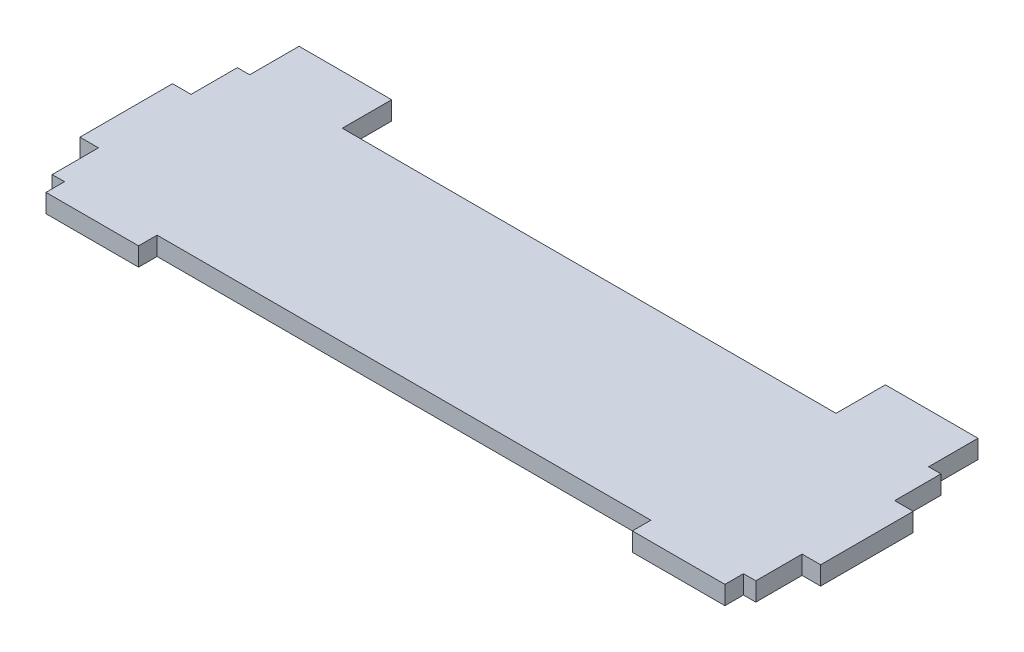
ISO-10303-21;
HEADER;
FILE_DESCRIPTION(('STEP AP214'),'2;1');
FILE_NAME('part.step','',(''),(''),'','','');
FILE_SCHEMA(('AUTOMOTIVE_DESIGN { 1 0 10303 214 1 1 1 1 }'));
ENDSEC;
DATA;
#1=APPLICATION_CONTEXT('core data for automotive mechanical design processes');
#2=APPLICATION_PROTOCOL_DEFINITION('international standard','automotive_design',2000,#1);
#3=PRODUCT_CONTEXT('',#1,'mechanical');
#4=PRODUCT('Part','Part','',(#3));
#5=PRODUCT_RELATED_PRODUCT_CATEGORY('part','',(#4));
#6=PRODUCT_DEFINITION_FORMATION('','',#4);
#7=PRODUCT_DEFINITION_CONTEXT('part definition',#1,'design');
#8=PRODUCT_DEFINITION('design','',#6,#7);
#9=PRODUCT_DEFINITION_SHAPE('','',#8);
#10=(LENGTH_UNIT() NAMED_UNIT(*) SI_UNIT(.MILLI.,.METRE.));
#11=(NAMED_UNIT(*) PLANE_ANGLE_UNIT() SI_UNIT($,.RADIAN.));
#12=(NAMED_UNIT(*) SI_UNIT($,.STERADIAN.) SOLID_ANGLE_UNIT());
#13=UNCERTAINTY_MEASURE_WITH_UNIT(LENGTH_MEASURE(1.E-05),#10,'distance_accuracy_value','');
#14=(GEOMETRIC_REPRESENTATION_CONTEXT(3) GLOBAL_UNCERTAINTY_ASSIGNED_CONTEXT((#13)) GLOBAL_UNIT_ASSIGNED_CONTEXT((#10,
#11,#12)) REPRESENTATION_CONTEXT('',''));
#15=CARTESIAN_POINT('',(0.,0.,0.));
#16=DIRECTION('',(0.,0.,1.));
#17=DIRECTION('',(1.,0.,0.));
#18=AXIS2_PLACEMENT_3D('',#15,#16,#17);
#19=CARTESIAN_POINT('',(57.,3.,-7.49999999999875));
#20=DIRECTION('',(0.,0.,1.));
#21=DIRECTION('',(1.,0.,0.));
#22=AXIS2_PLACEMENT_3D('',#19,#20,#21);
#23=PLANE('',#22);
#24=DIRECTION('',(-1.,0.,0.));
#25=VECTOR('',#24,1.);
#26=CARTESIAN_POINT('',(57.,0.,-7.49999999999875));
#27=LINE('',#26,#25);
#28=CARTESIAN_POINT('',(60.,0.,-7.49999999999875));
#29=VERTEX_POINT('',#28);
#30=CARTESIAN_POINT('',(57.,0.,-7.49999999999875));
#31=VERTEX_POINT('',#30);
#32=EDGE_CURVE('E249',#29,#31,#27,.T.);
#33=ORIENTED_EDGE('',*,*,#32,.T.);
#34=DIRECTION('',(0.,-1.,0.));
#35=VECTOR('',#34,1.);
#36=CARTESIAN_POINT('',(57.,3.,-7.49999999999875));
#37=LINE('',#36,#35);
#38=CARTESIAN_POINT('',(57.,3.,-7.49999999999875));
#39=VERTEX_POINT('',#38);
#40=EDGE_CURVE('E11',#39,#31,#37,.T.);
#41=ORIENTED_EDGE('',*,*,#40,.F.);
#42=DIRECTION('',(-1.,0.,0.));
#43=VECTOR('',#42,1.);
#44=CARTESIAN_POINT('',(57.,3.,-7.49999999999875));
#45=LINE('',#44,#43);
#46=CARTESIAN_POINT('',(60.,3.,-7.49999999999875));
#47=VERTEX_POINT('',#46);
#48=EDGE_CURVE('E303',#47,#39,#45,.T.);
#49=ORIENTED_EDGE('',*,*,#48,.F.);
#50=DIRECTION('',(0.,-1.,0.));
#51=VECTOR('',#50,1.);
#52=CARTESIAN_POINT('',(60.,3.,-7.49999999999875));
#53=LINE('',#52,#51);
#54=EDGE_CURVE('E245',#47,#29,#53,.T.);
#55=ORIENTED_EDGE('',*,*,#54,.T.);
#56=EDGE_LOOP('',(#33,#41,#49,#55));
#57=FACE_BOUND('',#56,.T.);
#58=ADVANCED_FACE('F33',(#57),#23,.F.);
#59=CARTESIAN_POINT('',(57.,3.,-15.));
#60=DIRECTION('',(-1.,0.,0.));
#61=DIRECTION('',(0.,0.,1.));
#62=AXIS2_PLACEMENT_3D('',#59,#60,#61);
#63=PLANE('',#62);
#64=DIRECTION('',(0.,0.,-1.));
#65=VECTOR('',#64,1.);
#66=CARTESIAN_POINT('',(57.,0.,-15.));
#67=LINE('',#66,#65);
#68=CARTESIAN_POINT('',(57.,0.,-15.));
#69=VERTEX_POINT('',#68);
#70=EDGE_CURVE('E252',#31,#69,#67,.T.);
#71=ORIENTED_EDGE('',*,*,#70,.T.);
#72=DIRECTION('',(0.,-1.,0.));
#73=VECTOR('',#72,1.);
#74=CARTESIAN_POINT('',(57.,3.,-15.));
#75=LINE('',#74,#73);
#76=CARTESIAN_POINT('',(57.,3.,-15.));
#77=VERTEX_POINT('',#76);
#78=EDGE_CURVE('E41',#77,#69,#75,.T.);
#79=ORIENTED_EDGE('',*,*,#78,.F.);
#80=DIRECTION('',(0.,0.,-1.));
#81=VECTOR('',#80,1.);
#82=CARTESIAN_POINT('',(57.,3.,-15.));
#83=LINE('',#82,#81);
#84=EDGE_CURVE('E152',#39,#77,#83,.T.);
#85=ORIENTED_EDGE('',*,*,#84,.F.);
#86=ORIENTED_EDGE('',*,*,#40,.T.);
#87=EDGE_LOOP('',(#71,#79,#85,#86));
#88=FACE_BOUND('',#87,.T.);
#89=ADVANCED_FACE('F461',(#88),#63,.F.);
#90=CARTESIAN_POINT('',(55.,3.,-15.));
#91=DIRECTION('',(0.,0.,1.));
#92=DIRECTION('',(1.,0.,0.));
#93=AXIS2_PLACEMENT_3D('',#90,#91,#92);
#94=PLANE('',#93);
#95=DIRECTION('',(-1.,0.,0.));
#96=VECTOR('',#95,1.);
#97=CARTESIAN_POINT('',(55.,0.,-15.));
#98=LINE('',#97,#96);
#99=CARTESIAN_POINT('',(55.,0.,-15.));
#100=VERTEX_POINT('',#99);
#101=EDGE_CURVE('E254',#69,#100,#98,.T.);
#102=ORIENTED_EDGE('',*,*,#101,.T.);
#103=DIRECTION('',(0.,-1.,0.));
#104=VECTOR('',#103,1.);
#105=CARTESIAN_POINT('',(55.,3.,-15.));
#106=LINE('',#105,#104);
#107=CARTESIAN_POINT('',(55.,3.,-15.));
#108=VERTEX_POINT('',#107);
#109=EDGE_CURVE('E370',#108,#100,#106,.T.);
#110=ORIENTED_EDGE('',*,*,#109,.F.);
#111=DIRECTION('',(-1.,0.,0.));
#112=VECTOR('',#111,1.);
#113=CARTESIAN_POINT('',(55.,3.,-15.));
#114=LINE('',#113,#112);
#115=EDGE_CURVE('E378',#77,#108,#114,.T.);
#116=ORIENTED_EDGE('',*,*,#115,.F.);
#117=ORIENTED_EDGE('',*,*,#78,.T.);
#118=EDGE_LOOP('',(#102,#110,#116,#117));
#119=FACE_BOUND('',#118,.T.);
#120=ADVANCED_FACE('F376',(#119),#94,.F.);
#121=CARTESIAN_POINT('',(55.,3.,-23.));
#122=DIRECTION('',(-1.,0.,0.));
#123=DIRECTION('',(0.,0.,1.));
#124=AXIS2_PLACEMENT_3D('',#121,#122,#123);
#125=PLANE('',#124);
#126=DIRECTION('',(0.,0.,-1.));
#127=VECTOR('',#126,1.);
#128=CARTESIAN_POINT('',(55.,0.,-23.));
#129=LINE('',#128,#127);
#130=CARTESIAN_POINT('',(55.,0.,-23.));
#131=VERTEX_POINT('',#130);
#132=EDGE_CURVE('E256',#100,#131,#129,.T.);
#133=ORIENTED_EDGE('',*,*,#132,.T.);
#134=DIRECTION('',(0.,-1.,0.));
#135=VECTOR('',#134,1.);
#136=CARTESIAN_POINT('',(55.,3.,-23.));
#137=LINE('',#136,#135);
#138=CARTESIAN_POINT('',(55.,3.,-23.));
#139=VERTEX_POINT('',#138);
#140=EDGE_CURVE('E367',#139,#131,#137,.T.);
#141=ORIENTED_EDGE('',*,*,#140,.F.);
#142=DIRECTION('',(0.,0.,-1.));
#143=VECTOR('',#142,1.);
#144=CARTESIAN_POINT('',(55.,3.,-23.));
#145=LINE('',#144,#143);
#146=EDGE_CURVE('E396',#108,#139,#145,.T.);
#147=ORIENTED_EDGE('',*,*,#146,.F.);
#148=ORIENTED_EDGE('',*,*,#109,.T.);
#149=EDGE_LOOP('',(#133,#141,#147,#148));
#150=FACE_BOUND('',#149,.T.);
#151=ADVANCED_FACE('F387',(#150),#125,.F.);
#152=CARTESIAN_POINT('',(40.,3.,-23.));
#153=DIRECTION('',(0.,0.,1.));
#154=DIRECTION('',(1.,0.,0.));
#155=AXIS2_PLACEMENT_3D('',#152,#153,#154);
#156=PLANE('',#155);
#157=DIRECTION('',(-1.,0.,0.));
#158=VECTOR('',#157,1.);
#159=CARTESIAN_POINT('',(40.,0.,-23.));
#160=LINE('',#159,#158);
#161=CARTESIAN_POINT('',(40.,0.,-23.));
#162=VERTEX_POINT('',#161);
#163=EDGE_CURVE('E258',#131,#162,#160,.T.);
#164=ORIENTED_EDGE('',*,*,#163,.T.);
#165=DIRECTION('',(0.,-1.,0.));
#166=VECTOR('',#165,1.);
#167=CARTESIAN_POINT('',(40.,3.,-23.));
#168=LINE('',#167,#166);
#169=CARTESIAN_POINT('',(40.,3.,-23.));
#170=VERTEX_POINT('',#169);
#171=EDGE_CURVE('E364',#170,#162,#168,.T.);
#172=ORIENTED_EDGE('',*,*,#171,.F.);
#173=DIRECTION('',(-1.,0.,0.));
#174=VECTOR('',#173,1.);
#175=CARTESIAN_POINT('',(40.,3.,-23.));
#176=LINE('',#175,#174);
#177=EDGE_CURVE('E393',#139,#170,#176,.T.);
#178=ORIENTED_EDGE('',*,*,#177,.F.);
#179=ORIENTED_EDGE('',*,*,#140,.T.);
#180=EDGE_LOOP('',(#164,#172,#178,#179));
#181=FACE_BOUND('',#180,.T.);
#182=ADVANCED_FACE('F391',(#181),#156,.F.);
#183=CARTESIAN_POINT('',(40.,3.,-15.));
#184=DIRECTION('',(1.,0.,0.));
#185=DIRECTION('',(0.,0.,-1.));
#186=AXIS2_PLACEMENT_3D('',#183,#184,#185);
#187=PLANE('',#186);
#188=DIRECTION('',(0.,0.,1.));
#189=VECTOR('',#188,1.);
#190=CARTESIAN_POINT('',(40.,0.,-15.));
#191=LINE('',#190,#189);
#192=CARTESIAN_POINT('',(40.,0.,-15.));
#193=VERTEX_POINT('',#192);
#194=EDGE_CURVE('E260',#162,#193,#191,.T.);
#195=ORIENTED_EDGE('',*,*,#194,.T.);
#196=DIRECTION('',(0.,-1.,0.));
#197=VECTOR('',#196,1.);
#198=CARTESIAN_POINT('',(40.,3.,-15.));
#199=LINE('',#198,#197);
#200=CARTESIAN_POINT('',(40.,3.,-15.));
#201=VERTEX_POINT('',#200);
#202=EDGE_CURVE('E361',#201,#193,#199,.T.);
#203=ORIENTED_EDGE('',*,*,#202,.F.);
#204=DIRECTION('',(0.,0.,1.));
#205=VECTOR('',#204,1.);
#206=CARTESIAN_POINT('',(40.,3.,-15.));
#207=LINE('',#206,#205);
#208=EDGE_CURVE('E395',#170,#201,#207,.T.);
#209=ORIENTED_EDGE('',*,*,#208,.F.);
#210=ORIENTED_EDGE('',*,*,#171,.T.);
#211=EDGE_LOOP('',(#195,#203,#209,#210));
#212=FACE_BOUND('',#211,.T.);
#213=ADVANCED_FACE('F474',(#212),#187,.F.);
#214=CARTESIAN_POINT('',(-40.,3.,-15.));
#215=DIRECTION('',(0.,0.,1.));
#216=DIRECTION('',(1.,0.,0.));
#217=AXIS2_PLACEMENT_3D('',#214,#215,#216);
#218=PLANE('',#217);
#219=DIRECTION('',(-1.,0.,0.));
#220=VECTOR('',#219,1.);
#221=CARTESIAN_POINT('',(-40.,0.,-15.));
#222=LINE('',#221,#220);
#223=CARTESIAN_POINT('',(-40.,0.,-15.));
#224=VERTEX_POINT('',#223);
#225=EDGE_CURVE('E262',#193,#224,#222,.T.);
#226=ORIENTED_EDGE('',*,*,#225,.T.);
#227=DIRECTION('',(0.,-1.,0.));
#228=VECTOR('',#227,1.);
#229=CARTESIAN_POINT('',(-40.,3.,-15.));
#230=LINE('',#229,#228);
#231=CARTESIAN_POINT('',(-40.,3.,-15.));
#232=VERTEX_POINT('',#231);
#233=EDGE_CURVE('E358',#232,#224,#230,.T.);
#234=ORIENTED_EDGE('',*,*,#233,.F.);
#235=DIRECTION('',(-1.,0.,0.));
#236=VECTOR('',#235,1.);
#237=CARTESIAN_POINT('',(-40.,3.,-15.));
#238=LINE('',#237,#236);
#239=EDGE_CURVE('E398',#201,#232,#238,.T.);
#240=ORIENTED_EDGE('',*,*,#239,.F.);
#241=ORIENTED_EDGE('',*,*,#202,.T.);
#242=EDGE_LOOP('',(#226,#234,#240,#241));
#243=FACE_BOUND('',#242,.T.);
#244=ADVANCED_FACE('F477',(#243),#218,.F.);
#245=CARTESIAN_POINT('',(-40.,3.,-23.));
#246=DIRECTION('',(-1.,0.,0.));
#247=DIRECTION('',(0.,0.,1.));
#248=AXIS2_PLACEMENT_3D('',#245,#246,#247);
#249=PLANE('',#248);
#250=DIRECTION('',(0.,0.,-1.));
#251=VECTOR('',#250,1.);
#252=CARTESIAN_POINT('',(-40.,0.,-23.));
#253=LINE('',#252,#251);
#254=CARTESIAN_POINT('',(-40.,0.,-23.));
#255=VERTEX_POINT('',#254);
#256=EDGE_CURVE('E264',#224,#255,#253,.T.);
#257=ORIENTED_EDGE('',*,*,#256,.T.);
#258=DIRECTION('',(0.,-1.,0.));
#259=VECTOR('',#258,1.);
#260=CARTESIAN_POINT('',(-40.,3.,-23.));
#261=LINE('',#260,#259);
#262=CARTESIAN_POINT('',(-40.,3.,-23.));
#263=VERTEX_POINT('',#262);
#264=EDGE_CURVE('E355',#263,#255,#261,.T.);
#265=ORIENTED_EDGE('',*,*,#264,.F.);
#266=DIRECTION('',(0.,0.,-1.));
#267=VECTOR('',#266,1.);
#268=CARTESIAN_POINT('',(-40.,3.,-23.));
#269=LINE('',#268,#267);
#270=EDGE_CURVE('E404',#232,#263,#269,.T.);
#271=ORIENTED_EDGE('',*,*,#270,.F.);
#272=ORIENTED_EDGE('',*,*,#233,.T.);
#273=EDGE_LOOP('',(#257,#265,#271,#272));
#274=FACE_BOUND('',#273,.T.);
#275=ADVANCED_FACE('F481',(#274),#249,.F.);
#276=CARTESIAN_POINT('',(-55.,3.,-23.));
#277=DIRECTION('',(0.,0.,1.));
#278=DIRECTION('',(1.,0.,0.));
#279=AXIS2_PLACEMENT_3D('',#276,#277,#278);
#280=PLANE('',#279);
#281=DIRECTION('',(-1.,0.,0.));
#282=VECTOR('',#281,1.);
#283=CARTESIAN_POINT('',(-55.,0.,-23.));
#284=LINE('',#283,#282);
#285=CARTESIAN_POINT('',(-55.,0.,-23.));
#286=VERTEX_POINT('',#285);
#287=EDGE_CURVE('E266',#255,#286,#284,.T.);
#288=ORIENTED_EDGE('',*,*,#287,.T.);
#289=DIRECTION('',(0.,-1.,0.));
#290=VECTOR('',#289,1.);
#291=CARTESIAN_POINT('',(-55.,3.,-23.));
#292=LINE('',#291,#290);
#293=CARTESIAN_POINT('',(-55.,3.,-23.));
#294=VERTEX_POINT('',#293);
#295=EDGE_CURVE('E352',#294,#286,#292,.T.);
#296=ORIENTED_EDGE('',*,*,#295,.F.);
#297=DIRECTION('',(-1.,0.,0.));
#298=VECTOR('',#297,1.);
#299=CARTESIAN_POINT('',(-55.,3.,-23.));
#300=LINE('',#299,#298);
#301=EDGE_CURVE('E406',#263,#294,#300,.T.);
#302=ORIENTED_EDGE('',*,*,#301,.F.);
#303=ORIENTED_EDGE('',*,*,#264,.T.);
#304=EDGE_LOOP('',(#288,#296,#302,#303));
#305=FACE_BOUND('',#304,.T.);
#306=ADVANCED_FACE('F485',(#305),#280,.F.);
#307=CARTESIAN_POINT('',(-55.,3.,-15.));
#308=DIRECTION('',(1.,0.,0.));
#309=DIRECTION('',(0.,0.,-1.));
#310=AXIS2_PLACEMENT_3D('',#307,#308,#309);
#311=PLANE('',#310);
#312=DIRECTION('',(0.,0.,1.));
#313=VECTOR('',#312,1.);
#314=CARTESIAN_POINT('',(-55.,0.,-15.));
#315=LINE('',#314,#313);
#316=CARTESIAN_POINT('',(-55.,0.,-15.));
#317=VERTEX_POINT('',#316);
#318=EDGE_CURVE('E268',#286,#317,#315,.T.);
#319=ORIENTED_EDGE('',*,*,#318,.T.);
#320=DIRECTION('',(0.,-1.,0.));
#321=VECTOR('',#320,1.);
#322=CARTESIAN_POINT('',(-55.,3.,-15.));
#323=LINE('',#322,#321);
#324=CARTESIAN_POINT('',(-55.,3.,-15.));
#325=VERTEX_POINT('',#324);
#326=EDGE_CURVE('E349',#325,#317,#323,.T.);
#327=ORIENTED_EDGE('',*,*,#326,.F.);
#328=DIRECTION('',(0.,0.,1.));
#329=VECTOR('',#328,1.);
#330=CARTESIAN_POINT('',(-55.,3.,-15.));
#331=LINE('',#330,#329);
#332=EDGE_CURVE('E408',#294,#325,#331,.T.);
#333=ORIENTED_EDGE('',*,*,#332,.F.);
#334=ORIENTED_EDGE('',*,*,#295,.T.);
#335=EDGE_LOOP('',(#319,#327,#333,#334));
#336=FACE_BOUND('',#335,.T.);
#337=ADVANCED_FACE('F489',(#336),#311,.F.);
#338=CARTESIAN_POINT('',(-57.,3.,-15.));
#339=DIRECTION('',(0.,0.,1.));
#340=DIRECTION('',(1.,0.,0.));
#341=AXIS2_PLACEMENT_3D('',#338,#339,#340);
#342=PLANE('',#341);
#343=DIRECTION('',(-1.,0.,0.));
#344=VECTOR('',#343,1.);
#345=CARTESIAN_POINT('',(-57.,0.,-15.));
#346=LINE('',#345,#344);
#347=CARTESIAN_POINT('',(-57.,0.,-15.));
#348=VERTEX_POINT('',#347);
#349=EDGE_CURVE('E270',#317,#348,#346,.T.);
#350=ORIENTED_EDGE('',*,*,#349,.T.);
#351=DIRECTION('',(0.,-1.,0.));
#352=VECTOR('',#351,1.);
#353=CARTESIAN_POINT('',(-57.,3.,-15.));
#354=LINE('',#353,#352);
#355=CARTESIAN_POINT('',(-57.,3.,-15.));
#356=VERTEX_POINT('',#355);
#357=EDGE_CURVE('E346',#356,#348,#354,.T.);
#358=ORIENTED_EDGE('',*,*,#357,.F.);
#359=DIRECTION('',(-1.,0.,0.));
#360=VECTOR('',#359,1.);
#361=CARTESIAN_POINT('',(-57.,3.,-15.));
#362=LINE('',#361,#360);
#363=EDGE_CURVE('E410',#325,#356,#362,.T.);
#364=ORIENTED_EDGE('',*,*,#363,.F.);
#365=ORIENTED_EDGE('',*,*,#326,.T.);
#366=EDGE_LOOP('',(#350,#358,#364,#365));
#367=FACE_BOUND('',#366,.T.);
#368=ADVANCED_FACE('F493',(#367),#342,.F.);
#369=CARTESIAN_POINT('',(-57.,3.,-7.5));
#370=DIRECTION('',(1.,0.,0.));
#371=DIRECTION('',(0.,0.,-1.));
#372=AXIS2_PLACEMENT_3D('',#369,#370,#371);
#373=PLANE('',#372);
#374=DIRECTION('',(0.,0.,1.));
#375=VECTOR('',#374,1.);
#376=CARTESIAN_POINT('',(-57.,0.,-7.5));
#377=LINE('',#376,#375);
#378=CARTESIAN_POINT('',(-57.,0.,-7.5));
#379=VERTEX_POINT('',#378);
#380=EDGE_CURVE('E272',#348,#379,#377,.T.);
#381=ORIENTED_EDGE('',*,*,#380,.T.);
#382=DIRECTION('',(0.,-1.,0.));
#383=VECTOR('',#382,1.);
#384=CARTESIAN_POINT('',(-57.,3.,-7.5));
#385=LINE('',#384,#383);
#386=CARTESIAN_POINT('',(-57.,3.,-7.5));
#387=VERTEX_POINT('',#386);
#388=EDGE_CURVE('E343',#387,#379,#385,.T.);
#389=ORIENTED_EDGE('',*,*,#388,.F.);
#390=DIRECTION('',(0.,0.,1.));
#391=VECTOR('',#390,1.);
#392=CARTESIAN_POINT('',(-57.,3.,-7.5));
#393=LINE('',#392,#391);
#394=EDGE_CURVE('E412',#356,#387,#393,.T.);
#395=ORIENTED_EDGE('',*,*,#394,.F.);
#396=ORIENTED_EDGE('',*,*,#357,.T.);
#397=EDGE_LOOP('',(#381,#389,#395,#396));
#398=FACE_BOUND('',#397,.T.);
#399=ADVANCED_FACE('F497',(#398),#373,.F.);
#400=CARTESIAN_POINT('',(-60.,3.,-7.5));
#401=DIRECTION('',(0.,0.,1.));
#402=DIRECTION('',(1.,0.,0.));
#403=AXIS2_PLACEMENT_3D('',#400,#401,#402);
#404=PLANE('',#403);
#405=DIRECTION('',(-1.,0.,0.));
#406=VECTOR('',#405,1.);
#407=CARTESIAN_POINT('',(-60.,0.,-7.5));
#408=LINE('',#407,#406);
#409=CARTESIAN_POINT('',(-60.,0.,-7.5));
#410=VERTEX_POINT('',#409);
#411=EDGE_CURVE('E274',#379,#410,#408,.T.);
#412=ORIENTED_EDGE('',*,*,#411,.T.);
#413=DIRECTION('',(0.,-1.,0.));
#414=VECTOR('',#413,1.);
#415=CARTESIAN_POINT('',(-60.,3.,-7.5));
#416=LINE('',#415,#414);
#417=CARTESIAN_POINT('',(-60.,3.,-7.5));
#418=VERTEX_POINT('',#417);
#419=EDGE_CURVE('E340',#418,#410,#416,.T.);
#420=ORIENTED_EDGE('',*,*,#419,.F.);
#421=DIRECTION('',(-1.,0.,0.));
#422=VECTOR('',#421,1.);
#423=CARTESIAN_POINT('',(-60.,3.,-7.5));
#424=LINE('',#423,#422);
#425=EDGE_CURVE('E414',#387,#418,#424,.T.);
#426=ORIENTED_EDGE('',*,*,#425,.F.);
#427=ORIENTED_EDGE('',*,*,#388,.T.);
#428=EDGE_LOOP('',(#412,#420,#426,#427));
#429=FACE_BOUND('',#428,.T.);
#430=ADVANCED_FACE('F501',(#429),#404,.F.);
#431=CARTESIAN_POINT('',(-60.,3.,7.5));
#432=DIRECTION('',(1.,0.,0.));
#433=DIRECTION('',(0.,0.,-1.));
#434=AXIS2_PLACEMENT_3D('',#431,#432,#433);
#435=PLANE('',#434);
#436=DIRECTION('',(0.,0.,1.));
#437=VECTOR('',#436,1.);
#438=CARTESIAN_POINT('',(-60.,0.,7.5));
#439=LINE('',#438,#437);
#440=CARTESIAN_POINT('',(-60.,0.,7.5));
#441=VERTEX_POINT('',#440);
#442=EDGE_CURVE('E276',#410,#441,#439,.T.);
#443=ORIENTED_EDGE('',*,*,#442,.T.);
#444=DIRECTION('',(0.,-1.,0.));
#445=VECTOR('',#444,1.);
#446=CARTESIAN_POINT('',(-60.,3.,7.5));
#447=LINE('',#446,#445);
#448=CARTESIAN_POINT('',(-60.,3.,7.5));
#449=VERTEX_POINT('',#448);
#450=EDGE_CURVE('E337',#449,#441,#447,.T.);
#451=ORIENTED_EDGE('',*,*,#450,.F.);
#452=DIRECTION('',(0.,0.,1.));
#453=VECTOR('',#452,1.);
#454=CARTESIAN_POINT('',(-60.,3.,7.5));
#455=LINE('',#454,#453);
#456=EDGE_CURVE('E416',#418,#449,#455,.T.);
#457=ORIENTED_EDGE('',*,*,#456,.F.);
#458=ORIENTED_EDGE('',*,*,#419,.T.);
#459=EDGE_LOOP('',(#443,#451,#457,#458));
#460=FACE_BOUND('',#459,.T.);
#461=ADVANCED_FACE('F505',(#460),#435,.F.);
#462=CARTESIAN_POINT('',(-57.,3.,7.5));
#463=DIRECTION('',(0.,0.,-1.));
#464=DIRECTION('',(-1.,0.,0.));
#465=AXIS2_PLACEMENT_3D('',#462,#463,#464);
#466=PLANE('',#465);
#467=DIRECTION('',(1.,0.,0.));
#468=VECTOR('',#467,1.);
#469=CARTESIAN_POINT('',(-57.,0.,7.5));
#470=LINE('',#469,#468);
#471=CARTESIAN_POINT('',(-57.,0.,7.5));
#472=VERTEX_POINT('',#471);
#473=EDGE_CURVE('E278',#441,#472,#470,.T.);
#474=ORIENTED_EDGE('',*,*,#473,.T.);
#475=DIRECTION('',(0.,-1.,0.));
#476=VECTOR('',#475,1.);
#477=CARTESIAN_POINT('',(-57.,3.,7.5));
#478=LINE('',#477,#476);
#479=CARTESIAN_POINT('',(-57.,3.,7.5));
#480=VERTEX_POINT('',#479);
#481=EDGE_CURVE('E334',#480,#472,#478,.T.);
#482=ORIENTED_EDGE('',*,*,#481,.F.);
#483=DIRECTION('',(1.,0.,0.));
#484=VECTOR('',#483,1.);
#485=CARTESIAN_POINT('',(-57.,3.,7.5));
#486=LINE('',#485,#484);
#487=EDGE_CURVE('E418',#449,#480,#486,.T.);
#488=ORIENTED_EDGE('',*,*,#487,.F.);
#489=ORIENTED_EDGE('',*,*,#450,.T.);
#490=EDGE_LOOP('',(#474,#482,#488,#489));
#491=FACE_BOUND('',#490,.T.);
#492=ADVANCED_FACE('F509',(#491),#466,.F.);
#493=CARTESIAN_POINT('',(-57.,3.,15.));
#494=DIRECTION('',(1.,0.,0.));
#495=DIRECTION('',(0.,0.,-1.));
#496=AXIS2_PLACEMENT_3D('',#493,#494,#495);
#497=PLANE('',#496);
#498=DIRECTION('',(0.,0.,1.));
#499=VECTOR('',#498,1.);
#500=CARTESIAN_POINT('',(-57.,0.,15.));
#501=LINE('',#500,#499);
#502=CARTESIAN_POINT('',(-57.,0.,15.));
#503=VERTEX_POINT('',#502);
#504=EDGE_CURVE('E280',#472,#503,#501,.T.);
#505=ORIENTED_EDGE('',*,*,#504,.T.);
#506=DIRECTION('',(0.,-1.,0.));
#507=VECTOR('',#506,1.);
#508=CARTESIAN_POINT('',(-57.,3.,15.));
#509=LINE('',#508,#507);
#510=CARTESIAN_POINT('',(-57.,3.,15.));
#511=VERTEX_POINT('',#510);
#512=EDGE_CURVE('E331',#511,#503,#509,.T.);
#513=ORIENTED_EDGE('',*,*,#512,.F.);
#514=DIRECTION('',(0.,0.,1.));
#515=VECTOR('',#514,1.);
#516=CARTESIAN_POINT('',(-57.,3.,15.));
#517=LINE('',#516,#515);
#518=EDGE_CURVE('E420',#480,#511,#517,.T.);
#519=ORIENTED_EDGE('',*,*,#518,.F.);
#520=ORIENTED_EDGE('',*,*,#481,.T.);
#521=EDGE_LOOP('',(#505,#513,#519,#520));
#522=FACE_BOUND('',#521,.T.);
#523=ADVANCED_FACE('F513',(#522),#497,.F.);
#524=CARTESIAN_POINT('',(-57.,3.,15.));
#525=DIRECTION('',(0.,0.,-1.));
#526=DIRECTION('',(-1.,0.,0.));
#527=AXIS2_PLACEMENT_3D('',#524,#525,#526);
#528=PLANE('',#527);
#529=DIRECTION('',(1.,0.,0.));
#530=VECTOR('',#529,1.);
#531=CARTESIAN_POINT('',(-57.,0.,15.));
#532=LINE('',#531,#530);
#533=CARTESIAN_POINT('',(-55.,0.,15.));
#534=VERTEX_POINT('',#533);
#535=EDGE_CURVE('E282',#503,#534,#532,.T.);
#536=ORIENTED_EDGE('',*,*,#535,.T.);
#537=DIRECTION('',(0.,-1.,0.));
#538=VECTOR('',#537,1.);
#539=CARTESIAN_POINT('',(-55.,3.,15.));
#540=LINE('',#539,#538);
#541=CARTESIAN_POINT('',(-55.,3.,15.));
#542=VERTEX_POINT('',#541);
#543=EDGE_CURVE('E328',#542,#534,#540,.T.);
#544=ORIENTED_EDGE('',*,*,#543,.F.);
#545=DIRECTION('',(1.,0.,0.));
#546=VECTOR('',#545,1.);
#547=CARTESIAN_POINT('',(-57.,3.,15.));
#548=LINE('',#547,#546);
#549=EDGE_CURVE('E422',#511,#542,#548,.T.);
#550=ORIENTED_EDGE('',*,*,#549,.F.);
#551=ORIENTED_EDGE('',*,*,#512,.T.);
#552=EDGE_LOOP('',(#536,#544,#550,#551));
#553=FACE_BOUND('',#552,.T.);
#554=ADVANCED_FACE('F517',(#553),#528,.F.);
#555=CARTESIAN_POINT('',(-55.,3.,15.));
#556=DIRECTION('',(1.,0.,0.));
#557=DIRECTION('',(0.,0.,-1.));
#558=AXIS2_PLACEMENT_3D('',#555,#556,#557);
#559=PLANE('',#558);
#560=DIRECTION('',(0.,0.,1.));
#561=VECTOR('',#560,1.);
#562=CARTESIAN_POINT('',(-55.,0.,15.));
#563=LINE('',#562,#561);
#564=CARTESIAN_POINT('',(-55.,0.,18.));
#565=VERTEX_POINT('',#564);
#566=EDGE_CURVE('E284',#534,#565,#563,.T.);
#567=ORIENTED_EDGE('',*,*,#566,.T.);
#568=DIRECTION('',(0.,-1.,0.));
#569=VECTOR('',#568,1.);
#570=CARTESIAN_POINT('',(-55.,3.,18.));
#571=LINE('',#570,#569);
#572=CARTESIAN_POINT('',(-55.,3.,18.));
#573=VERTEX_POINT('',#572);
#574=EDGE_CURVE('E325',#573,#565,#571,.T.);
#575=ORIENTED_EDGE('',*,*,#574,.F.);
#576=DIRECTION('',(0.,0.,1.));
#577=VECTOR('',#576,1.);
#578=CARTESIAN_POINT('',(-55.,3.,15.));
#579=LINE('',#578,#577);
#580=EDGE_CURVE('E424',#542,#573,#579,.T.);
#581=ORIENTED_EDGE('',*,*,#580,.F.);
#582=ORIENTED_EDGE('',*,*,#543,.T.);
#583=EDGE_LOOP('',(#567,#575,#581,#582));
#584=FACE_BOUND('',#583,.T.);
#585=ADVANCED_FACE('F521',(#584),#559,.F.);
#586=CARTESIAN_POINT('',(-55.,3.,18.));
#587=DIRECTION('',(0.,0.,-1.));
#588=DIRECTION('',(-1.,0.,0.));
#589=AXIS2_PLACEMENT_3D('',#586,#587,#588);
#590=PLANE('',#589);
#591=DIRECTION('',(1.,0.,0.));
#592=VECTOR('',#591,1.);
#593=CARTESIAN_POINT('',(-55.,0.,18.));
#594=LINE('',#593,#592);
#595=CARTESIAN_POINT('',(-40.,0.,18.));
#596=VERTEX_POINT('',#595);
#597=EDGE_CURVE('E286',#565,#596,#594,.T.);
#598=ORIENTED_EDGE('',*,*,#597,.T.);
#599=DIRECTION('',(0.,-1.,0.));
#600=VECTOR('',#599,1.);
#601=CARTESIAN_POINT('',(-40.,3.,18.));
#602=LINE('',#601,#600);
#603=CARTESIAN_POINT('',(-40.,3.,18.));
#604=VERTEX_POINT('',#603);
#605=EDGE_CURVE('E322',#604,#596,#602,.T.);
#606=ORIENTED_EDGE('',*,*,#605,.F.);
#607=DIRECTION('',(1.,0.,0.));
#608=VECTOR('',#607,1.);
#609=CARTESIAN_POINT('',(-55.,3.,18.));
#610=LINE('',#609,#608);
#611=EDGE_CURVE('E426',#573,#604,#610,.T.);
#612=ORIENTED_EDGE('',*,*,#611,.F.);
#613=ORIENTED_EDGE('',*,*,#574,.T.);
#614=EDGE_LOOP('',(#598,#606,#612,#613));
#615=FACE_BOUND('',#614,.T.);
#616=ADVANCED_FACE('F525',(#615),#590,.F.);
#617=CARTESIAN_POINT('',(-40.,3.,18.));
#618=DIRECTION('',(-1.,0.,0.));
#619=DIRECTION('',(0.,0.,1.));
#620=AXIS2_PLACEMENT_3D('',#617,#618,#619);
#621=PLANE('',#620);
#622=DIRECTION('',(0.,0.,-1.));
#623=VECTOR('',#622,1.);
#624=CARTESIAN_POINT('',(-40.,0.,18.));
#625=LINE('',#624,#623);
#626=CARTESIAN_POINT('',(-40.,0.,15.));
#627=VERTEX_POINT('',#626);
#628=EDGE_CURVE('E288',#596,#627,#625,.T.);
#629=ORIENTED_EDGE('',*,*,#628,.T.);
#630=DIRECTION('',(0.,-1.,0.));
#631=VECTOR('',#630,1.);
#632=CARTESIAN_POINT('',(-40.,3.,15.));
#633=LINE('',#632,#631);
#634=CARTESIAN_POINT('',(-40.,3.,15.));
#635=VERTEX_POINT('',#634);
#636=EDGE_CURVE('E319',#635,#627,#633,.T.);
#637=ORIENTED_EDGE('',*,*,#636,.F.);
#638=DIRECTION('',(0.,0.,-1.));
#639=VECTOR('',#638,1.);
#640=CARTESIAN_POINT('',(-40.,3.,18.));
#641=LINE('',#640,#639);
#642=EDGE_CURVE('E428',#604,#635,#641,.T.);
#643=ORIENTED_EDGE('',*,*,#642,.F.);
#644=ORIENTED_EDGE('',*,*,#605,.T.);
#645=EDGE_LOOP('',(#629,#637,#643,#644));
#646=FACE_BOUND('',#645,.T.);
#647=ADVANCED_FACE('F529',(#646),#621,.F.);
#648=CARTESIAN_POINT('',(-40.,3.,15.));
#649=DIRECTION('',(0.,0.,-1.));
#650=DIRECTION('',(-1.,0.,0.));
#651=AXIS2_PLACEMENT_3D('',#648,#649,#650);
#652=PLANE('',#651);
#653=DIRECTION('',(1.,0.,0.));
#654=VECTOR('',#653,1.);
#655=CARTESIAN_POINT('',(-40.,0.,15.));
#656=LINE('',#655,#654);
#657=CARTESIAN_POINT('',(40.,0.,15.));
#658=VERTEX_POINT('',#657);
#659=EDGE_CURVE('E290',#627,#658,#656,.T.);
#660=ORIENTED_EDGE('',*,*,#659,.T.);
#661=DIRECTION('',(0.,-1.,0.));
#662=VECTOR('',#661,1.);
#663=CARTESIAN_POINT('',(40.,3.,15.));
#664=LINE('',#663,#662);
#665=CARTESIAN_POINT('',(40.,3.,15.));
#666=VERTEX_POINT('',#665);
#667=EDGE_CURVE('E316',#666,#658,#664,.T.);
#668=ORIENTED_EDGE('',*,*,#667,.F.);
#669=DIRECTION('',(1.,0.,0.));
#670=VECTOR('',#669,1.);
#671=CARTESIAN_POINT('',(-40.,3.,15.));
#672=LINE('',#671,#670);
#673=EDGE_CURVE('E430',#635,#666,#672,.T.);
#674=ORIENTED_EDGE('',*,*,#673,.F.);
#675=ORIENTED_EDGE('',*,*,#636,.T.);
#676=EDGE_LOOP('',(#660,#668,#674,#675));
#677=FACE_BOUND('',#676,.T.);
#678=ADVANCED_FACE('F533',(#677),#652,.F.);
#679=CARTESIAN_POINT('',(40.,3.,15.));
#680=DIRECTION('',(1.,0.,0.));
#681=DIRECTION('',(0.,0.,-1.));
#682=AXIS2_PLACEMENT_3D('',#679,#680,#681);
#683=PLANE('',#682);
#684=DIRECTION('',(0.,0.,1.));
#685=VECTOR('',#684,1.);
#686=CARTESIAN_POINT('',(40.,0.,15.));
#687=LINE('',#686,#685);
#688=CARTESIAN_POINT('',(40.,0.,18.));
#689=VERTEX_POINT('',#688);
#690=EDGE_CURVE('E292',#658,#689,#687,.T.);
#691=ORIENTED_EDGE('',*,*,#690,.T.);
#692=DIRECTION('',(0.,-1.,0.));
#693=VECTOR('',#692,1.);
#694=CARTESIAN_POINT('',(40.,3.,18.));
#695=LINE('',#694,#693);
#696=CARTESIAN_POINT('',(40.,3.,18.));
#697=VERTEX_POINT('',#696);
#698=EDGE_CURVE('E313',#697,#689,#695,.T.);
#699=ORIENTED_EDGE('',*,*,#698,.F.);
#700=DIRECTION('',(0.,0.,1.));
#701=VECTOR('',#700,1.);
#702=CARTESIAN_POINT('',(40.,3.,15.));
#703=LINE('',#702,#701);
#704=EDGE_CURVE('E432',#666,#697,#703,.T.);
#705=ORIENTED_EDGE('',*,*,#704,.F.);
#706=ORIENTED_EDGE('',*,*,#667,.T.);
#707=EDGE_LOOP('',(#691,#699,#705,#706));
#708=FACE_BOUND('',#707,.T.);
#709=ADVANCED_FACE('F537',(#708),#683,.F.);
#710=CARTESIAN_POINT('',(40.,3.,18.));
#711=DIRECTION('',(0.,0.,-1.));
#712=DIRECTION('',(-1.,0.,0.));
#713=AXIS2_PLACEMENT_3D('',#710,#711,#712);
#714=PLANE('',#713);
#715=DIRECTION('',(1.,0.,0.));
#716=VECTOR('',#715,1.);
#717=CARTESIAN_POINT('',(40.,0.,18.));
#718=LINE('',#717,#716);
#719=CARTESIAN_POINT('',(55.,0.,18.));
#720=VERTEX_POINT('',#719);
#721=EDGE_CURVE('E294',#689,#720,#718,.T.);
#722=ORIENTED_EDGE('',*,*,#721,.T.);
#723=DIRECTION('',(0.,-1.,0.));
#724=VECTOR('',#723,1.);
#725=CARTESIAN_POINT('',(55.,3.,18.));
#726=LINE('',#725,#724);
#727=CARTESIAN_POINT('',(55.,3.,18.));
#728=VERTEX_POINT('',#727);
#729=EDGE_CURVE('E310',#728,#720,#726,.T.);
#730=ORIENTED_EDGE('',*,*,#729,.F.);
#731=DIRECTION('',(1.,0.,0.));
#732=VECTOR('',#731,1.);
#733=CARTESIAN_POINT('',(40.,3.,18.));
#734=LINE('',#733,#732);
#735=EDGE_CURVE('E434',#697,#728,#734,.T.);
#736=ORIENTED_EDGE('',*,*,#735,.F.);
#737=ORIENTED_EDGE('',*,*,#698,.T.);
#738=EDGE_LOOP('',(#722,#730,#736,#737));
#739=FACE_BOUND('',#738,.T.);
#740=ADVANCED_FACE('F541',(#739),#714,.F.);
#741=CARTESIAN_POINT('',(55.,3.,18.));
#742=DIRECTION('',(-1.,0.,0.));
#743=DIRECTION('',(0.,0.,1.));
#744=AXIS2_PLACEMENT_3D('',#741,#742,#743);
#745=PLANE('',#744);
#746=DIRECTION('',(0.,0.,-1.));
#747=VECTOR('',#746,1.);
#748=CARTESIAN_POINT('',(55.,0.,18.));
#749=LINE('',#748,#747);
#750=CARTESIAN_POINT('',(55.,0.,15.));
#751=VERTEX_POINT('',#750);
#752=EDGE_CURVE('E296',#720,#751,#749,.T.);
#753=ORIENTED_EDGE('',*,*,#752,.T.);
#754=DIRECTION('',(0.,-1.,0.));
#755=VECTOR('',#754,1.);
#756=CARTESIAN_POINT('',(55.,3.,15.));
#757=LINE('',#756,#755);
#758=CARTESIAN_POINT('',(55.,3.,15.));
#759=VERTEX_POINT('',#758);
#760=EDGE_CURVE('E307',#759,#751,#757,.T.);
#761=ORIENTED_EDGE('',*,*,#760,.F.);
#762=DIRECTION('',(0.,0.,-1.));
#763=VECTOR('',#762,1.);
#764=CARTESIAN_POINT('',(55.,3.,18.));
#765=LINE('',#764,#763);
#766=EDGE_CURVE('E436',#728,#759,#765,.T.);
#767=ORIENTED_EDGE('',*,*,#766,.F.);
#768=ORIENTED_EDGE('',*,*,#729,.T.);
#769=EDGE_LOOP('',(#753,#761,#767,#768));
#770=FACE_BOUND('',#769,.T.);
#771=ADVANCED_FACE('F442',(#770),#745,.F.);
#772=CARTESIAN_POINT('',(55.,3.,15.));
#773=DIRECTION('',(0.,0.,-1.));
#774=DIRECTION('',(-1.,0.,0.));
#775=AXIS2_PLACEMENT_3D('',#772,#773,#774);
#776=PLANE('',#775);
#777=DIRECTION('',(1.,0.,0.));
#778=VECTOR('',#777,1.);
#779=CARTESIAN_POINT('',(55.,0.,15.));
#780=LINE('',#779,#778);
#781=CARTESIAN_POINT('',(57.,0.,15.));
#782=VERTEX_POINT('',#781);
#783=EDGE_CURVE('E298',#751,#782,#780,.T.);
#784=ORIENTED_EDGE('',*,*,#783,.T.);
#785=DIRECTION('',(0.,-1.,0.));
#786=VECTOR('',#785,1.);
#787=CARTESIAN_POINT('',(57.,3.,15.));
#788=LINE('',#787,#786);
#789=CARTESIAN_POINT('',(57.,3.,15.));
#790=VERTEX_POINT('',#789);
#791=EDGE_CURVE('E240',#790,#782,#788,.T.);
#792=ORIENTED_EDGE('',*,*,#791,.F.);
#793=DIRECTION('',(1.,0.,0.));
#794=VECTOR('',#793,1.);
#795=CARTESIAN_POINT('',(55.,3.,15.));
#796=LINE('',#795,#794);
#797=EDGE_CURVE('E231',#759,#790,#796,.T.);
#798=ORIENTED_EDGE('',*,*,#797,.F.);
#799=ORIENTED_EDGE('',*,*,#760,.T.);
#800=EDGE_LOOP('',(#784,#792,#798,#799));
#801=FACE_BOUND('',#800,.T.);
#802=ADVANCED_FACE('F446',(#801),#776,.F.);
#803=CARTESIAN_POINT('',(57.,3.,7.49999999999976));
#804=DIRECTION('',(-1.,0.,0.));
#805=DIRECTION('',(0.,0.,1.));
#806=AXIS2_PLACEMENT_3D('',#803,#804,#805);
#807=PLANE('',#806);
#808=DIRECTION('',(0.,0.,-1.));
#809=VECTOR('',#808,1.);
#810=CARTESIAN_POINT('',(57.,0.,7.49999999999976));
#811=LINE('',#810,#809);
#812=CARTESIAN_POINT('',(57.,0.,7.49999999999976));
#813=VERTEX_POINT('',#812);
#814=EDGE_CURVE('E239',#782,#813,#811,.T.);
#815=ORIENTED_EDGE('',*,*,#814,.T.);
#816=DIRECTION('',(0.,-1.,0.));
#817=VECTOR('',#816,1.);
#818=CARTESIAN_POINT('',(57.,3.,7.49999999999976));
#819=LINE('',#818,#817);
#820=CARTESIAN_POINT('',(57.,3.,7.49999999999976));
#821=VERTEX_POINT('',#820);
#822=EDGE_CURVE('E236',#821,#813,#819,.T.);
#823=ORIENTED_EDGE('',*,*,#822,.F.);
#824=DIRECTION('',(0.,0.,-1.));
#825=VECTOR('',#824,1.);
#826=CARTESIAN_POINT('',(57.,3.,7.49999999999976));
#827=LINE('',#826,#825);
#828=EDGE_CURVE('E225',#790,#821,#827,.T.);
#829=ORIENTED_EDGE('',*,*,#828,.F.);
#830=ORIENTED_EDGE('',*,*,#791,.T.);
#831=EDGE_LOOP('',(#815,#823,#829,#830));
#832=FACE_BOUND('',#831,.T.);
#833=ADVANCED_FACE('F237',(#832),#807,.F.);
#834=CARTESIAN_POINT('',(60.,3.,7.49999999999976));
#835=DIRECTION('',(0.,0.,-1.));
#836=DIRECTION('',(-1.,0.,0.));
#837=AXIS2_PLACEMENT_3D('',#834,#835,#836);
#838=PLANE('',#837);
#839=DIRECTION('',(1.,0.,0.));
#840=VECTOR('',#839,1.);
#841=CARTESIAN_POINT('',(60.,0.,7.49999999999976));
#842=LINE('',#841,#840);
#843=CARTESIAN_POINT('',(60.,0.,7.49999999999976));
#844=VERTEX_POINT('',#843);
#845=EDGE_CURVE('E138',#813,#844,#842,.T.);
#846=ORIENTED_EDGE('',*,*,#845,.T.);
#847=DIRECTION('',(0.,-1.,0.));
#848=VECTOR('',#847,1.);
#849=CARTESIAN_POINT('',(60.,3.,7.49999999999976));
#850=LINE('',#849,#848);
#851=CARTESIAN_POINT('',(60.,3.,7.49999999999976));
#852=VERTEX_POINT('',#851);
#853=EDGE_CURVE('E241',#852,#844,#850,.T.);
#854=ORIENTED_EDGE('',*,*,#853,.F.);
#855=DIRECTION('',(1.,0.,0.));
#856=VECTOR('',#855,1.);
#857=CARTESIAN_POINT('',(60.,3.,7.49999999999976));
#858=LINE('',#857,#856);
#859=EDGE_CURVE('E229',#821,#852,#858,.T.);
#860=ORIENTED_EDGE('',*,*,#859,.F.);
#861=ORIENTED_EDGE('',*,*,#822,.T.);
#862=EDGE_LOOP('',(#846,#854,#860,#861));
#863=FACE_BOUND('',#862,.T.);
#864=ADVANCED_FACE('F243',(#863),#838,.F.);
#865=CARTESIAN_POINT('',(60.,3.,-7.49999999999875));
#866=DIRECTION('',(-1.,0.,0.));
#867=DIRECTION('',(0.,0.,1.));
#868=AXIS2_PLACEMENT_3D('',#865,#866,#867);
#869=PLANE('',#868);
#870=DIRECTION('',(0.,0.,-1.));
#871=VECTOR('',#870,1.);
#872=CARTESIAN_POINT('',(60.,0.,-7.49999999999875));
#873=LINE('',#872,#871);
#874=EDGE_CURVE('E144',#844,#29,#873,.T.);
#875=ORIENTED_EDGE('',*,*,#874,.T.);
#876=ORIENTED_EDGE('',*,*,#54,.F.);
#877=DIRECTION('',(0.,0.,-1.));
#878=VECTOR('',#877,1.);
#879=CARTESIAN_POINT('',(60.,3.,-7.49999999999875));
#880=LINE('',#879,#878);
#881=EDGE_CURVE('E49',#852,#47,#880,.T.);
#882=ORIENTED_EDGE('',*,*,#881,.F.);
#883=ORIENTED_EDGE('',*,*,#853,.T.);
#884=EDGE_LOOP('',(#875,#876,#882,#883));
#885=FACE_BOUND('',#884,.T.);
#886=ADVANCED_FACE('F450',(#885),#869,.F.);
#887=CARTESIAN_POINT('',(0.,3.,0.));
#888=DIRECTION('',(0.,-1.,0.));
#889=DIRECTION('',(0.,0.,-1.));
#890=AXIS2_PLACEMENT_3D('',#887,#888,#889);
#891=PLANE('',#890);
#892=ORIENTED_EDGE('',*,*,#48,.T.);
#893=ORIENTED_EDGE('',*,*,#84,.T.);
#894=ORIENTED_EDGE('',*,*,#115,.T.);
#895=ORIENTED_EDGE('',*,*,#146,.T.);
#896=ORIENTED_EDGE('',*,*,#177,.T.);
#897=ORIENTED_EDGE('',*,*,#208,.T.);
#898=ORIENTED_EDGE('',*,*,#239,.T.);
#899=ORIENTED_EDGE('',*,*,#270,.T.);
#900=ORIENTED_EDGE('',*,*,#301,.T.);
#901=ORIENTED_EDGE('',*,*,#332,.T.);
#902=ORIENTED_EDGE('',*,*,#363,.T.);
#903=ORIENTED_EDGE('',*,*,#394,.T.);
#904=ORIENTED_EDGE('',*,*,#425,.T.);
#905=ORIENTED_EDGE('',*,*,#456,.T.);
#906=ORIENTED_EDGE('',*,*,#487,.T.);
#907=ORIENTED_EDGE('',*,*,#518,.T.);
#908=ORIENTED_EDGE('',*,*,#549,.T.);
#909=ORIENTED_EDGE('',*,*,#580,.T.);
#910=ORIENTED_EDGE('',*,*,#611,.T.);
#911=ORIENTED_EDGE('',*,*,#642,.T.);
#912=ORIENTED_EDGE('',*,*,#673,.T.);
#913=ORIENTED_EDGE('',*,*,#704,.T.);
#914=ORIENTED_EDGE('',*,*,#735,.T.);
#915=ORIENTED_EDGE('',*,*,#766,.T.);
#916=ORIENTED_EDGE('',*,*,#797,.T.);
#917=ORIENTED_EDGE('',*,*,#828,.T.);
#918=ORIENTED_EDGE('',*,*,#859,.T.);
#919=ORIENTED_EDGE('',*,*,#881,.T.);
#920=EDGE_LOOP('',(#892,#893,#894,#895,#896,#897,#898,#899,#900,#901,#902,#903,#904,#905,#906,
#907,#908,#909,#910,#911,#912,#913,#914,#915,#916,#917,#918,#919));
#921=FACE_BOUND('',#920,.T.);
#922=ADVANCED_FACE('F227',(#921),#891,.F.);
#923=CARTESIAN_POINT('',(0.,0.,0.));
#924=DIRECTION('',(0.,-1.,0.));
#925=DIRECTION('',(0.,0.,-1.));
#926=AXIS2_PLACEMENT_3D('',#923,#924,#925);
#927=PLANE('',#926);
#928=ORIENTED_EDGE('',*,*,#32,.F.);
#929=ORIENTED_EDGE('',*,*,#874,.F.);
#930=ORIENTED_EDGE('',*,*,#845,.F.);
#931=ORIENTED_EDGE('',*,*,#814,.F.);
#932=ORIENTED_EDGE('',*,*,#783,.F.);
#933=ORIENTED_EDGE('',*,*,#752,.F.);
#934=ORIENTED_EDGE('',*,*,#721,.F.);
#935=ORIENTED_EDGE('',*,*,#690,.F.);
#936=ORIENTED_EDGE('',*,*,#659,.F.);
#937=ORIENTED_EDGE('',*,*,#628,.F.);
#938=ORIENTED_EDGE('',*,*,#597,.F.);
#939=ORIENTED_EDGE('',*,*,#566,.F.);
#940=ORIENTED_EDGE('',*,*,#535,.F.);
#941=ORIENTED_EDGE('',*,*,#504,.F.);
#942=ORIENTED_EDGE('',*,*,#473,.F.);
#943=ORIENTED_EDGE('',*,*,#442,.F.);
#944=ORIENTED_EDGE('',*,*,#411,.F.);
#945=ORIENTED_EDGE('',*,*,#380,.F.);
#946=ORIENTED_EDGE('',*,*,#349,.F.);
#947=ORIENTED_EDGE('',*,*,#318,.F.);
#948=ORIENTED_EDGE('',*,*,#287,.F.);
#949=ORIENTED_EDGE('',*,*,#256,.F.);
#950=ORIENTED_EDGE('',*,*,#225,.F.);
#951=ORIENTED_EDGE('',*,*,#194,.F.);
#952=ORIENTED_EDGE('',*,*,#163,.F.);
#953=ORIENTED_EDGE('',*,*,#132,.F.);
#954=ORIENTED_EDGE('',*,*,#101,.F.);
#955=ORIENTED_EDGE('',*,*,#70,.F.);
#956=EDGE_LOOP('',(#928,#929,#930,#931,#932,#933,#934,#935,#936,#937,#938,#939,#940,#941,#942,
#943,#944,#945,#946,#947,#948,#949,#950,#951,#952,#953,#954,#955));
#957=FACE_BOUND('',#956,.T.);
#958=ADVANCED_FACE('F382',(#957),#927,.T.);
#959=CLOSED_SHELL('',(#58,#89,#120,#151,#182,#213,#244,#275,#306,#337,#368,#399,#430,#461,#492,
#523,#554,#585,#616,#647,#678,#709,#740,#771,#802,#833,#864,#886,#922,#958));
#960=MANIFOLD_SOLID_BREP('B2',#959);
#961=ADVANCED_BREP_SHAPE_REPRESENTATION('',(#18,#960),#14);
#962=SHAPE_DEFINITION_REPRESENTATION(#9,#961);
ENDSEC;
END-ISO-10303-21;
